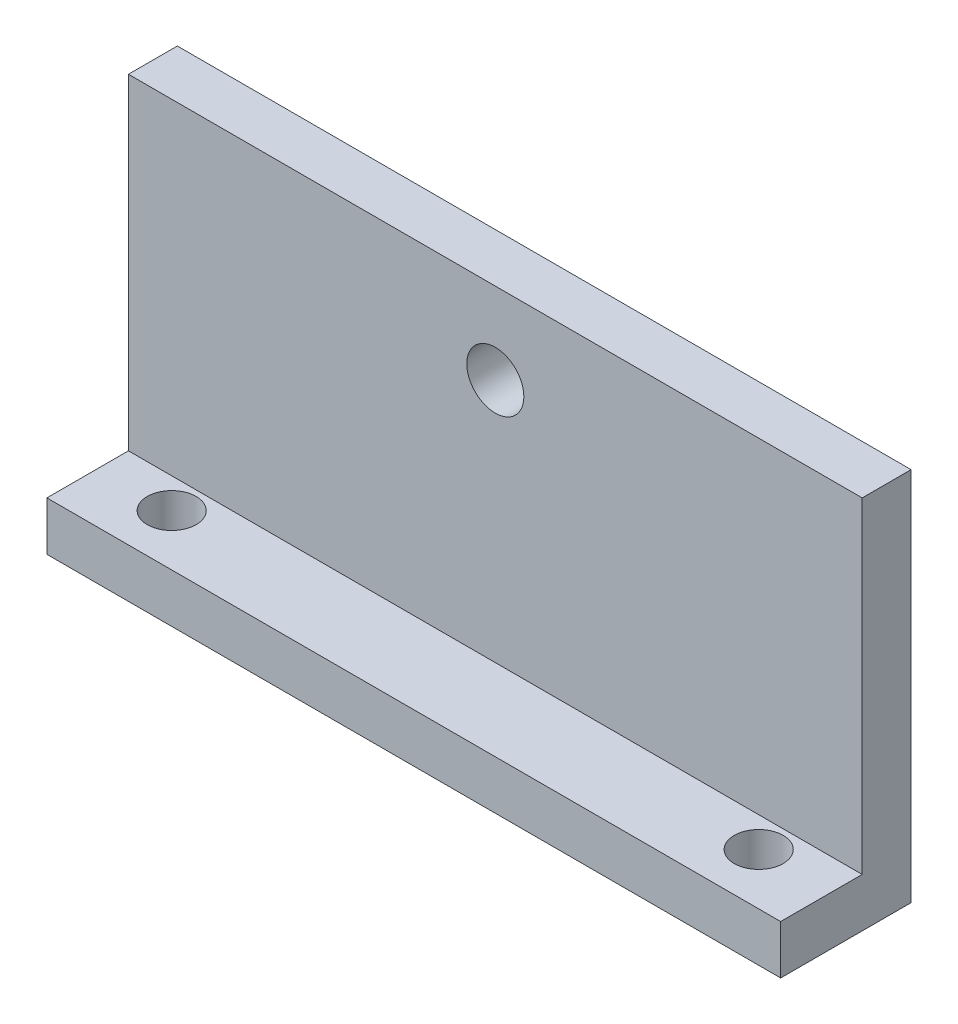
ISO-10303-21;
HEADER;
FILE_DESCRIPTION(('STEP AP214'),'2;1');
FILE_NAME('part.step','',(''),(''),'','','');
FILE_SCHEMA(('AUTOMOTIVE_DESIGN { 1 0 10303 214 1 1 1 1 }'));
ENDSEC;
DATA;
#1=APPLICATION_CONTEXT('core data for automotive mechanical design processes');
#2=APPLICATION_PROTOCOL_DEFINITION('international standard','automotive_design',2000,#1);
#3=PRODUCT_CONTEXT('',#1,'mechanical');
#4=PRODUCT('Part','Part','',(#3));
#5=PRODUCT_RELATED_PRODUCT_CATEGORY('part','',(#4));
#6=PRODUCT_DEFINITION_FORMATION('','',#4);
#7=PRODUCT_DEFINITION_CONTEXT('part definition',#1,'design');
#8=PRODUCT_DEFINITION('design','',#6,#7);
#9=PRODUCT_DEFINITION_SHAPE('','',#8);
#10=(LENGTH_UNIT() NAMED_UNIT(*) SI_UNIT(.MILLI.,.METRE.));
#11=(NAMED_UNIT(*) PLANE_ANGLE_UNIT() SI_UNIT($,.RADIAN.));
#12=(NAMED_UNIT(*) SI_UNIT($,.STERADIAN.) SOLID_ANGLE_UNIT());
#13=UNCERTAINTY_MEASURE_WITH_UNIT(LENGTH_MEASURE(1.E-05),#10,'distance_accuracy_value','');
#14=(GEOMETRIC_REPRESENTATION_CONTEXT(3) GLOBAL_UNCERTAINTY_ASSIGNED_CONTEXT((#13)) GLOBAL_UNIT_ASSIGNED_CONTEXT((#10,
#11,#12)) REPRESENTATION_CONTEXT('',''));
#15=CARTESIAN_POINT('',(0.,0.,0.));
#16=DIRECTION('',(0.,0.,1.));
#17=DIRECTION('',(1.,0.,0.));
#18=AXIS2_PLACEMENT_3D('',#15,#16,#17);
#19=CARTESIAN_POINT('',(0.,3.,0.));
#20=DIRECTION('',(0.,-1.,0.));
#21=DIRECTION('',(0.,0.,-1.));
#22=AXIS2_PLACEMENT_3D('',#19,#20,#21);
#23=PLANE('',#22);
#24=CARTESIAN_POINT('',(-16.4842105263158,3.,0.));
#25=DIRECTION('',(0.,1.,0.));
#26=DIRECTION('',(0.,0.,1.));
#27=AXIS2_PLACEMENT_3D('',#24,#25,#26);
#28=CIRCLE('',#27,1.5);
#29=CARTESIAN_POINT('',(-16.4842105263158,3.,1.5));
#30=VERTEX_POINT('',#29);
#31=EDGE_CURVE('E148',#30,#30,#28,.T.);
#32=ORIENTED_EDGE('',*,*,#31,.F.);
#33=EDGE_LOOP('',(#32));
#34=FACE_BOUND('',#33,.T.);
#35=CARTESIAN_POINT('',(19.5157894736842,3.,0.));
#36=DIRECTION('',(0.,1.,0.));
#37=DIRECTION('',(0.,0.,1.));
#38=AXIS2_PLACEMENT_3D('',#35,#36,#37);
#39=CIRCLE('',#38,1.5);
#40=CARTESIAN_POINT('',(19.5157894736842,3.,1.5));
#41=VERTEX_POINT('',#40);
#42=EDGE_CURVE('E103',#41,#41,#39,.T.);
#43=ORIENTED_EDGE('',*,*,#42,.F.);
#44=EDGE_LOOP('',(#43));
#45=FACE_BOUND('',#44,.T.);
#46=DIRECTION('',(1.,0.,0.));
#47=VECTOR('',#46,1.);
#48=CARTESIAN_POINT('',(-20.9842105263158,3.,-1.84666299519495));
#49=LINE('',#48,#47);
#50=CARTESIAN_POINT('',(-20.9842105263158,3.,-1.84666299519495));
#51=VERTEX_POINT('',#50);
#52=CARTESIAN_POINT('',(24.0157894736842,3.,-1.84666299519495));
#53=VERTEX_POINT('',#52);
#54=EDGE_CURVE('E56',#51,#53,#49,.T.);
#55=ORIENTED_EDGE('',*,*,#54,.F.);
#56=DIRECTION('',(0.,0.,1.));
#57=VECTOR('',#56,1.);
#58=CARTESIAN_POINT('',(-20.9842105263158,3.,3.15333700480505));
#59=LINE('',#58,#57);
#60=CARTESIAN_POINT('',(-20.9842105263158,3.,3.15333700480505));
#61=VERTEX_POINT('',#60);
#62=EDGE_CURVE('E155',#51,#61,#59,.T.);
#63=ORIENTED_EDGE('',*,*,#62,.T.);
#64=DIRECTION('',(1.,0.,0.));
#65=VECTOR('',#64,1.);
#66=CARTESIAN_POINT('',(-20.9842105263158,3.,3.15333700480505));
#67=LINE('',#66,#65);
#68=CARTESIAN_POINT('',(24.0157894736842,3.,3.15333700480505));
#69=VERTEX_POINT('',#68);
#70=EDGE_CURVE('E62',#61,#69,#67,.T.);
#71=ORIENTED_EDGE('',*,*,#70,.T.);
#72=DIRECTION('',(0.,0.,-1.));
#73=VECTOR('',#72,1.);
#74=CARTESIAN_POINT('',(24.0157894736842,3.,3.15333700480505));
#75=LINE('',#74,#73);
#76=EDGE_CURVE('E91',#69,#53,#75,.T.);
#77=ORIENTED_EDGE('',*,*,#76,.T.);
#78=EDGE_LOOP('',(#55,#63,#71,#77));
#79=FACE_BOUND('',#78,.T.);
#80=ADVANCED_FACE('F41',(#34,#45,#79),#23,.F.);
#81=CARTESIAN_POINT('',(0.,0.,0.));
#82=DIRECTION('',(0.,-1.,0.));
#83=DIRECTION('',(0.,0.,-1.));
#84=AXIS2_PLACEMENT_3D('',#81,#82,#83);
#85=PLANE('',#84);
#86=CARTESIAN_POINT('',(19.5157894736842,0.,0.));
#87=DIRECTION('',(0.,1.,0.));
#88=DIRECTION('',(0.,0.,1.));
#89=AXIS2_PLACEMENT_3D('',#86,#87,#88);
#90=CIRCLE('',#89,1.5);
#91=CARTESIAN_POINT('',(19.5157894736842,0.,1.5));
#92=VERTEX_POINT('',#91);
#93=EDGE_CURVE('E107',#92,#92,#90,.T.);
#94=ORIENTED_EDGE('',*,*,#93,.T.);
#95=EDGE_LOOP('',(#94));
#96=FACE_BOUND('',#95,.T.);
#97=DIRECTION('',(0.,0.,-1.));
#98=VECTOR('',#97,1.);
#99=CARTESIAN_POINT('',(24.0157894736842,0.,3.15333700480505));
#100=LINE('',#99,#98);
#101=CARTESIAN_POINT('',(24.0157894736842,0.,3.15333700480505));
#102=VERTEX_POINT('',#101);
#103=CARTESIAN_POINT('',(24.0157894736842,0.,-4.84666299519495));
#104=VERTEX_POINT('',#103);
#105=EDGE_CURVE('E97',#102,#104,#100,.T.);
#106=ORIENTED_EDGE('',*,*,#105,.F.);
#107=DIRECTION('',(1.,0.,0.));
#108=VECTOR('',#107,1.);
#109=CARTESIAN_POINT('',(-20.9842105263158,0.,3.15333700480505));
#110=LINE('',#109,#108);
#111=CARTESIAN_POINT('',(-20.9842105263158,0.,3.15333700480505));
#112=VERTEX_POINT('',#111);
#113=EDGE_CURVE('E81',#112,#102,#110,.T.);
#114=ORIENTED_EDGE('',*,*,#113,.F.);
#115=DIRECTION('',(0.,0.,1.));
#116=VECTOR('',#115,1.);
#117=CARTESIAN_POINT('',(-20.9842105263158,0.,3.15333700480505));
#118=LINE('',#117,#116);
#119=CARTESIAN_POINT('',(-20.9842105263158,0.,-4.84666299519495));
#120=VERTEX_POINT('',#119);
#121=EDGE_CURVE('E92',#120,#112,#118,.T.);
#122=ORIENTED_EDGE('',*,*,#121,.F.);
#123=DIRECTION('',(-1.,0.,0.));
#124=VECTOR('',#123,1.);
#125=CARTESIAN_POINT('',(-20.9842105263158,0.,-4.84666299519495));
#126=LINE('',#125,#124);
#127=EDGE_CURVE('E102',#104,#120,#126,.T.);
#128=ORIENTED_EDGE('',*,*,#127,.F.);
#129=EDGE_LOOP('',(#106,#114,#122,#128));
#130=FACE_BOUND('',#129,.T.);
#131=CARTESIAN_POINT('',(-16.4842105263158,0.,0.));
#132=DIRECTION('',(0.,1.,0.));
#133=DIRECTION('',(0.,0.,1.));
#134=AXIS2_PLACEMENT_3D('',#131,#132,#133);
#135=CIRCLE('',#134,1.5);
#136=CARTESIAN_POINT('',(-16.4842105263158,0.,1.5));
#137=VERTEX_POINT('',#136);
#138=EDGE_CURVE('E147',#137,#137,#135,.T.);
#139=ORIENTED_EDGE('',*,*,#138,.T.);
#140=EDGE_LOOP('',(#139));
#141=FACE_BOUND('',#140,.T.);
#142=ADVANCED_FACE('F100',(#96,#130,#141),#85,.T.);
#143=CARTESIAN_POINT('',(24.0157894736842,3.,3.15333700480505));
#144=DIRECTION('',(-1.,0.,0.));
#145=DIRECTION('',(0.,0.,1.));
#146=AXIS2_PLACEMENT_3D('',#143,#144,#145);
#147=PLANE('',#146);
#148=ORIENTED_EDGE('',*,*,#105,.T.);
#149=DIRECTION('',(0.,-1.,0.));
#150=VECTOR('',#149,1.);
#151=CARTESIAN_POINT('',(24.0157894736842,3.,-4.84666299519495));
#152=LINE('',#151,#150);
#153=CARTESIAN_POINT('',(24.0157894736842,23.,-4.84666299519495));
#154=VERTEX_POINT('',#153);
#155=EDGE_CURVE('E11',#154,#104,#152,.T.);
#156=ORIENTED_EDGE('',*,*,#155,.F.);
#157=DIRECTION('',(0.,0.,-1.));
#158=VECTOR('',#157,1.);
#159=CARTESIAN_POINT('',(24.0157894736842,23.,-4.84666299519495));
#160=LINE('',#159,#158);
#161=CARTESIAN_POINT('',(24.0157894736842,23.,-1.84666299519495));
#162=VERTEX_POINT('',#161);
#163=EDGE_CURVE('E134',#162,#154,#160,.T.);
#164=ORIENTED_EDGE('',*,*,#163,.F.);
#165=DIRECTION('',(0.,-1.,0.));
#166=VECTOR('',#165,1.);
#167=CARTESIAN_POINT('',(24.0157894736842,23.,-1.84666299519495));
#168=LINE('',#167,#166);
#169=EDGE_CURVE('E135',#162,#53,#168,.T.);
#170=ORIENTED_EDGE('',*,*,#169,.T.);
#171=ORIENTED_EDGE('',*,*,#76,.F.);
#172=DIRECTION('',(0.,-1.,0.));
#173=VECTOR('',#172,1.);
#174=CARTESIAN_POINT('',(24.0157894736842,3.,3.15333700480505));
#175=LINE('',#174,#173);
#176=EDGE_CURVE('E84',#69,#102,#175,.T.);
#177=ORIENTED_EDGE('',*,*,#176,.T.);
#178=EDGE_LOOP('',(#148,#156,#164,#170,#171,#177));
#179=FACE_BOUND('',#178,.T.);
#180=ADVANCED_FACE('F43',(#179),#147,.F.);
#181=CARTESIAN_POINT('',(-20.9842105263158,3.,-4.84666299519495));
#182=DIRECTION('',(0.,0.,1.));
#183=DIRECTION('',(1.,0.,0.));
#184=AXIS2_PLACEMENT_3D('',#181,#182,#183);
#185=PLANE('',#184);
#186=CARTESIAN_POINT('',(1.51578947368422,18.,-4.84666299519495));
#187=DIRECTION('',(0.,0.,1.));
#188=DIRECTION('',(1.,0.,0.));
#189=AXIS2_PLACEMENT_3D('',#186,#187,#188);
#190=CIRCLE('',#189,1.75);
#191=CARTESIAN_POINT('',(3.26578947368422,18.,-4.84666299519495));
#192=VERTEX_POINT('',#191);
#193=EDGE_CURVE('E143',#192,#192,#190,.T.);
#194=ORIENTED_EDGE('',*,*,#193,.T.);
#195=EDGE_LOOP('',(#194));
#196=FACE_BOUND('',#195,.T.);
#197=ORIENTED_EDGE('',*,*,#127,.T.);
#198=DIRECTION('',(0.,-1.,0.));
#199=VECTOR('',#198,1.);
#200=CARTESIAN_POINT('',(-20.9842105263158,3.,-4.84666299519495));
#201=LINE('',#200,#199);
#202=CARTESIAN_POINT('',(-20.9842105263158,23.,-4.84666299519495));
#203=VERTEX_POINT('',#202);
#204=EDGE_CURVE('E49',#203,#120,#201,.T.);
#205=ORIENTED_EDGE('',*,*,#204,.F.);
#206=DIRECTION('',(-1.,0.,0.));
#207=VECTOR('',#206,1.);
#208=CARTESIAN_POINT('',(-20.9842105263158,23.,-4.84666299519495));
#209=LINE('',#208,#207);
#210=EDGE_CURVE('E126',#154,#203,#209,.T.);
#211=ORIENTED_EDGE('',*,*,#210,.F.);
#212=ORIENTED_EDGE('',*,*,#155,.T.);
#213=EDGE_LOOP('',(#197,#205,#211,#212));
#214=FACE_BOUND('',#213,.T.);
#215=ADVANCED_FACE('F124',(#196,#214),#185,.F.);
#216=CARTESIAN_POINT('',(-20.9842105263158,3.,3.15333700480505));
#217=DIRECTION('',(1.,0.,0.));
#218=DIRECTION('',(0.,0.,-1.));
#219=AXIS2_PLACEMENT_3D('',#216,#217,#218);
#220=PLANE('',#219);
#221=ORIENTED_EDGE('',*,*,#121,.T.);
#222=DIRECTION('',(0.,-1.,0.));
#223=VECTOR('',#222,1.);
#224=CARTESIAN_POINT('',(-20.9842105263158,3.,3.15333700480505));
#225=LINE('',#224,#223);
#226=EDGE_CURVE('E87',#61,#112,#225,.T.);
#227=ORIENTED_EDGE('',*,*,#226,.F.);
#228=ORIENTED_EDGE('',*,*,#62,.F.);
#229=DIRECTION('',(0.,-1.,0.));
#230=VECTOR('',#229,1.);
#231=CARTESIAN_POINT('',(-20.9842105263158,23.,-1.84666299519495));
#232=LINE('',#231,#230);
#233=CARTESIAN_POINT('',(-20.9842105263158,23.,-1.84666299519495));
#234=VERTEX_POINT('',#233);
#235=EDGE_CURVE('E137',#234,#51,#232,.T.);
#236=ORIENTED_EDGE('',*,*,#235,.F.);
#237=DIRECTION('',(0.,0.,1.));
#238=VECTOR('',#237,1.);
#239=CARTESIAN_POINT('',(-20.9842105263158,23.,-4.84666299519495));
#240=LINE('',#239,#238);
#241=EDGE_CURVE('E120',#203,#234,#240,.T.);
#242=ORIENTED_EDGE('',*,*,#241,.F.);
#243=ORIENTED_EDGE('',*,*,#204,.T.);
#244=EDGE_LOOP('',(#221,#227,#228,#236,#242,#243));
#245=FACE_BOUND('',#244,.T.);
#246=ADVANCED_FACE('F117',(#245),#220,.F.);
#247=CARTESIAN_POINT('',(-20.9842105263158,3.,3.15333700480505));
#248=DIRECTION('',(0.,0.,-1.));
#249=DIRECTION('',(-1.,0.,0.));
#250=AXIS2_PLACEMENT_3D('',#247,#248,#249);
#251=PLANE('',#250);
#252=ORIENTED_EDGE('',*,*,#113,.T.);
#253=ORIENTED_EDGE('',*,*,#176,.F.);
#254=ORIENTED_EDGE('',*,*,#70,.F.);
#255=ORIENTED_EDGE('',*,*,#226,.T.);
#256=EDGE_LOOP('',(#252,#253,#254,#255));
#257=FACE_BOUND('',#256,.T.);
#258=ADVANCED_FACE('F83',(#257),#251,.F.);
#259=CARTESIAN_POINT('',(19.5157894736842,3.,0.));
#260=DIRECTION('',(0.,-1.,0.));
#261=DIRECTION('',(0.,0.,-1.));
#262=AXIS2_PLACEMENT_3D('',#259,#260,#261);
#263=CYLINDRICAL_SURFACE('',#262,1.5);
#264=ORIENTED_EDGE('',*,*,#42,.T.);
#265=EDGE_LOOP('',(#264));
#266=FACE_BOUND('',#265,.T.);
#267=ORIENTED_EDGE('',*,*,#93,.F.);
#268=EDGE_LOOP('',(#267));
#269=FACE_BOUND('',#268,.T.);
#270=ADVANCED_FACE('F184',(#266,#269),#263,.F.);
#271=CARTESIAN_POINT('',(-16.4842105263158,3.,0.));
#272=DIRECTION('',(0.,-1.,0.));
#273=DIRECTION('',(0.,0.,-1.));
#274=AXIS2_PLACEMENT_3D('',#271,#272,#273);
#275=CYLINDRICAL_SURFACE('',#274,1.5);
#276=ORIENTED_EDGE('',*,*,#31,.T.);
#277=EDGE_LOOP('',(#276));
#278=FACE_BOUND('',#277,.T.);
#279=ORIENTED_EDGE('',*,*,#138,.F.);
#280=EDGE_LOOP('',(#279));
#281=FACE_BOUND('',#280,.T.);
#282=ADVANCED_FACE('F175',(#278,#281),#275,.F.);
#283=CARTESIAN_POINT('',(-20.9842105263158,23.,-1.84666299519495));
#284=DIRECTION('',(0.,0.,-1.));
#285=DIRECTION('',(-1.,0.,0.));
#286=AXIS2_PLACEMENT_3D('',#283,#284,#285);
#287=PLANE('',#286);
#288=CARTESIAN_POINT('',(1.51578947368422,18.,-1.84666299519495));
#289=DIRECTION('',(0.,0.,1.));
#290=DIRECTION('',(1.,0.,0.));
#291=AXIS2_PLACEMENT_3D('',#288,#289,#290);
#292=CIRCLE('',#291,1.75);
#293=CARTESIAN_POINT('',(3.26578947368422,18.,-1.84666299519495));
#294=VERTEX_POINT('',#293);
#295=EDGE_CURVE('E167',#294,#294,#292,.T.);
#296=ORIENTED_EDGE('',*,*,#295,.F.);
#297=EDGE_LOOP('',(#296));
#298=FACE_BOUND('',#297,.T.);
#299=ORIENTED_EDGE('',*,*,#54,.T.);
#300=ORIENTED_EDGE('',*,*,#169,.F.);
#301=DIRECTION('',(1.,0.,0.));
#302=VECTOR('',#301,1.);
#303=CARTESIAN_POINT('',(-20.9842105263158,23.,-1.84666299519495));
#304=LINE('',#303,#302);
#305=EDGE_CURVE('E139',#234,#162,#304,.T.);
#306=ORIENTED_EDGE('',*,*,#305,.F.);
#307=ORIENTED_EDGE('',*,*,#235,.T.);
#308=EDGE_LOOP('',(#299,#300,#306,#307));
#309=FACE_BOUND('',#308,.T.);
#310=ADVANCED_FACE('F158',(#298,#309),#287,.F.);
#311=CARTESIAN_POINT('',(0.,23.,0.));
#312=DIRECTION('',(0.,1.,0.));
#313=DIRECTION('',(0.,0.,1.));
#314=AXIS2_PLACEMENT_3D('',#311,#312,#313);
#315=PLANE('',#314);
#316=ORIENTED_EDGE('',*,*,#241,.T.);
#317=ORIENTED_EDGE('',*,*,#305,.T.);
#318=ORIENTED_EDGE('',*,*,#163,.T.);
#319=ORIENTED_EDGE('',*,*,#210,.T.);
#320=EDGE_LOOP('',(#316,#317,#318,#319));
#321=FACE_BOUND('',#320,.T.);
#322=ADVANCED_FACE('F130',(#321),#315,.T.);
#323=CARTESIAN_POINT('',(1.51578947368422,18.,-21.846662995195));
#324=DIRECTION('',(0.,0.,1.));
#325=DIRECTION('',(1.,0.,0.));
#326=AXIS2_PLACEMENT_3D('',#323,#324,#325);
#327=CYLINDRICAL_SURFACE('',#326,1.75);
#328=ORIENTED_EDGE('',*,*,#295,.T.);
#329=EDGE_LOOP('',(#328));
#330=FACE_BOUND('',#329,.T.);
#331=ORIENTED_EDGE('',*,*,#193,.F.);
#332=EDGE_LOOP('',(#331));
#333=FACE_BOUND('',#332,.T.);
#334=ADVANCED_FACE('F171',(#330,#333),#327,.F.);
#335=CLOSED_SHELL('',(#80,#142,#180,#215,#246,#258,#270,#282,#310,#322,#334));
#336=MANIFOLD_SOLID_BREP('B2',#335);
#337=ADVANCED_BREP_SHAPE_REPRESENTATION('',(#18,#336),#14);
#338=SHAPE_DEFINITION_REPRESENTATION(#9,#337);
ENDSEC;
END-ISO-10303-21;
